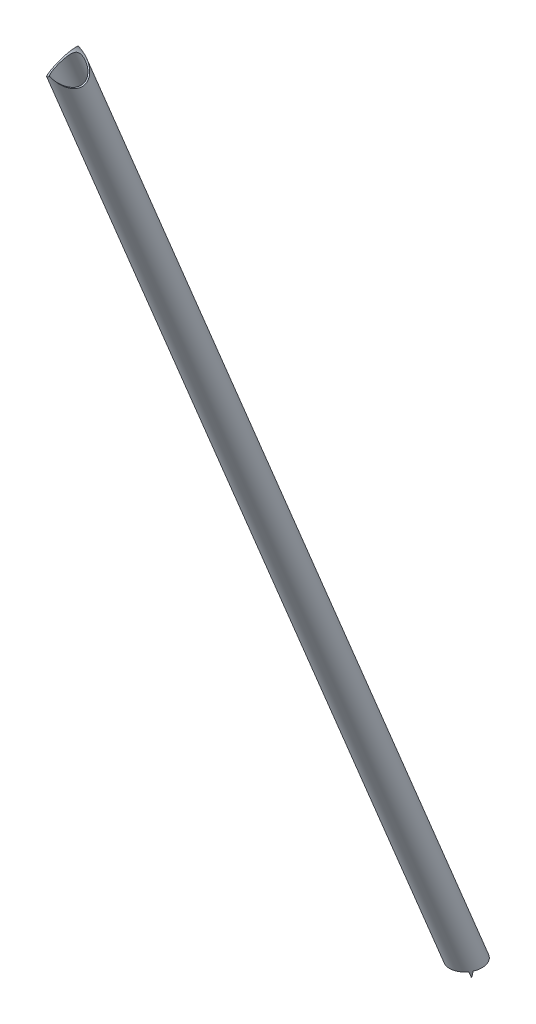
ISO-10303-21;
HEADER;
FILE_DESCRIPTION(('STEP AP214'),'2;1');
FILE_NAME('part.step','',(''),(''),'','','');
FILE_SCHEMA(('AUTOMOTIVE_DESIGN { 1 0 10303 214 1 1 1 1 }'));
ENDSEC;
DATA;
#1=APPLICATION_CONTEXT('core data for automotive mechanical design processes');
#2=APPLICATION_PROTOCOL_DEFINITION('international standard','automotive_design',2000,#1);
#3=PRODUCT_CONTEXT('',#1,'mechanical');
#4=PRODUCT('Part','Part','',(#3));
#5=PRODUCT_RELATED_PRODUCT_CATEGORY('part','',(#4));
#6=PRODUCT_DEFINITION_FORMATION('','',#4);
#7=PRODUCT_DEFINITION_CONTEXT('part definition',#1,'design');
#8=PRODUCT_DEFINITION('design','',#6,#7);
#9=PRODUCT_DEFINITION_SHAPE('','',#8);
#10=(LENGTH_UNIT() NAMED_UNIT(*) SI_UNIT(.MILLI.,.METRE.));
#11=(NAMED_UNIT(*) PLANE_ANGLE_UNIT() SI_UNIT($,.RADIAN.));
#12=(NAMED_UNIT(*) SI_UNIT($,.STERADIAN.) SOLID_ANGLE_UNIT());
#13=UNCERTAINTY_MEASURE_WITH_UNIT(LENGTH_MEASURE(1.E-05),#10,'distance_accuracy_value','');
#14=(GEOMETRIC_REPRESENTATION_CONTEXT(3) GLOBAL_UNCERTAINTY_ASSIGNED_CONTEXT((#13)) GLOBAL_UNIT_ASSIGNED_CONTEXT((#10,
#11,#12)) REPRESENTATION_CONTEXT('',''));
#15=CARTESIAN_POINT('',(0.,0.,0.));
#16=DIRECTION('',(0.,0.,1.));
#17=DIRECTION('',(1.,0.,0.));
#18=AXIS2_PLACEMENT_3D('',#15,#16,#17);
#19=CARTESIAN_POINT('',(-1.11022302462516E-13,220.,-2300.));
#20=DIRECTION('',(0.,0.924802742541058,0.380446957391614));
#21=DIRECTION('',(0.,-0.380446957391614,0.924802742541059));
#22=AXIS2_PLACEMENT_3D('',#19,#20,#21);
#23=CYLINDRICAL_SURFACE('',#22,11.3);
#24=CARTESIAN_POINT('',(-11.2687458040523,1004.8226800173,-1978.04643616126));
#25=CARTESIAN_POINT('',(-11.2865523696665,1004.70854791084,-1977.8350239228));
#26=CARTESIAN_POINT('',(-11.2968083806208,1004.60066949885,-1977.61956967504));
#27=CARTESIAN_POINT('',(-11.30191885456,1004.39861350157,-1977.18213308968));
#28=CARTESIAN_POINT('',(-11.2967720729068,1004.30443702414,-1976.96015022596));
#29=CARTESIAN_POINT('',(-11.2710830903614,1004.13066682036,-1976.51136398655));
#30=CARTESIAN_POINT('',(-11.2505377131257,1004.05107610691,-1976.28455962568));
#31=CARTESIAN_POINT('',(-11.1943675321715,1003.90705679274,-1975.82803597576));
#32=CARTESIAN_POINT('',(-11.1587428603624,1003.84262805938,-1975.59831671222));
#33=CARTESIAN_POINT('',(-11.0731670424558,1003.72931323976,-1975.13861797924));
#34=CARTESIAN_POINT('',(-11.0232666374574,1003.68037337571,-1974.90864225538));
#35=CARTESIAN_POINT('',(-10.9099069609047,1003.59756025133,-1974.4493476787));
#36=CARTESIAN_POINT('',(-10.8464478441185,1003.56368681903,-1974.22002881842));
#37=CARTESIAN_POINT('',(-10.7069069146002,1003.51052942502,-1973.76349587879));
#38=CARTESIAN_POINT('',(-10.6308212207814,1003.49124995928,-1973.53628246934));
#39=CARTESIAN_POINT('',(-10.4670582556134,1003.4665934746,-1973.08528800388));
#40=CARTESIAN_POINT('',(-10.3793783479058,1003.46121962332,-1972.86150774147));
#41=CARTESIAN_POINT('',(-10.1633026289968,1003.46390701718,-1972.34659987682));
#42=CARTESIAN_POINT('',(-10.0309227290432,1003.47688911417,-1972.05716054207));
#43=CARTESIAN_POINT('',(-9.74988806537977,1003.52354041488,-1971.4880229878));
#44=CARTESIAN_POINT('',(-9.60122845530434,1003.5572157927,-1971.20832770185));
#45=CARTESIAN_POINT('',(-9.28930272517062,1003.6430347293,-1970.65940421992));
#46=CARTESIAN_POINT('',(-9.12600664755471,1003.69521684341,-1970.39019918789));
#47=CARTESIAN_POINT('',(-8.78673740970921,1003.81574738832,-1969.86374076717));
#48=CARTESIAN_POINT('',(-8.61076418206435,1003.88409590508,-1969.60648744206));
#49=CARTESIAN_POINT('',(-8.17806086381178,1004.06354214064,-1969.00862763146));
#50=CARTESIAN_POINT('',(-7.91613831956516,1004.18100024831,-1968.67367316694));
#51=CARTESIAN_POINT('',(-7.37274403009796,1004.43715999221,-1968.02852520268));
#52=CARTESIAN_POINT('',(-7.09126169880413,1004.57587318175,-1967.71834530963));
#53=CARTESIAN_POINT('',(-6.50995563095446,1004.8689774046,-1967.12409906159));
#54=CARTESIAN_POINT('',(-6.21014204005313,1005.02335979628,-1966.84001847567));
#55=CARTESIAN_POINT('',(-5.59167457349068,1005.34191191047,-1966.29946837379));
#56=CARTESIAN_POINT('',(-5.27303204228159,1005.50607574014,-1966.04298248955));
#57=CARTESIAN_POINT('',(-4.78040600904947,1005.75334190211,-1965.68210665244));
#58=CARTESIAN_POINT('',(-4.61439270140469,1005.8356286149,-1965.5661745195));
#59=CARTESIAN_POINT('',(-4.27662440746054,1005.99948813861,-1965.34247553885));
#60=CARTESIAN_POINT('',(-4.10487043087901,1006.08106107192,-1965.23470726598));
#61=CARTESIAN_POINT('',(-3.75502077722081,1006.24194976214,-1965.0281964025));
#62=CARTESIAN_POINT('',(-3.57692621719724,1006.32126591224,-1964.92945223288));
#63=CARTESIAN_POINT('',(-3.21363038578171,1006.47564188125,-1964.74219247343));
#64=CARTESIAN_POINT('',(-3.02843043413689,1006.55070248422,-1964.65367499623));
#65=CARTESIAN_POINT('',(-2.69484151327059,1006.67698972803,-1964.50808528343));
#66=CARTESIAN_POINT('',(-2.54808961530746,1006.72965841545,-1964.44852399587));
#67=CARTESIAN_POINT('',(-2.24967545158098,1006.82947261195,-1964.33736256774));
#68=CARTESIAN_POINT('',(-2.09801189527622,1006.87661665415,-1964.28576454041));
#69=CARTESIAN_POINT('',(-1.79013712553334,1006.96348209244,-1964.19189478801));
#70=CARTESIAN_POINT('',(-1.63393786764089,1007.00322125967,-1964.14960068895));
#71=CARTESIAN_POINT('',(-1.31707684209714,1007.0734230159,-1964.07560079144));
#72=CARTESIAN_POINT('',(-1.15641895468921,1007.10389341113,-1964.04388608078));
#73=CARTESIAN_POINT('',(-0.866975607799162,1007.14824847329,-1963.99800134437));
#74=CARTESIAN_POINT('',(-0.738889858063716,1007.16430185513,-1963.9815125468));
#75=CARTESIAN_POINT('',(-0.481276892495036,1007.18886914493,-1963.95634605455));
#76=CARTESIAN_POINT('',(-0.351750395619061,1007.19738665632,-1963.94766462658));
#77=CARTESIAN_POINT('',(-0.0921781960286921,1007.20645686817,-1963.9384207529));
#78=CARTESIAN_POINT('',(0.0378672437700233,1007.20701318914,-1963.9378546166));
#79=CARTESIAN_POINT('',(0.29750832599735,1007.20016203207,-1963.94483608625));
#80=CARTESIAN_POINT('',(0.427103947612461,1007.19275419032,-1963.95238406275));
#81=CARTESIAN_POINT('',(0.81262053412939,1007.15914982008,-1963.98676265728));
#82=CARTESIAN_POINT('',(1.06662034339358,1007.12161397549,-1964.02528420499));
#83=CARTESIAN_POINT('',(1.56416372222666,1007.02246629697,-1964.12908319464));
#84=CARTESIAN_POINT('',(1.80768864187702,1006.96081334571,-1964.19440634006));
#85=CARTESIAN_POINT('',(2.27263580727385,1006.82394170595,-1964.34323517227));
#86=CARTESIAN_POINT('',(2.49455755761445,1006.7494110271,-1964.42584997838));
#87=CARTESIAN_POINT('',(2.9282008204083,1006.59051034536,-1964.60710842573));
#88=CARTESIAN_POINT('',(3.1399125545589,1006.50613116486,-1964.70576705208));
#89=CARTESIAN_POINT('',(3.5548709285938,1006.33130192597,-1964.9168347752));
#90=CARTESIAN_POINT('',(3.75808057556241,1006.24082906961,-1965.02929696994));
#91=CARTESIAN_POINT('',(4.15632569615254,1006.05706930216,-1965.26588985657));
#92=CARTESIAN_POINT('',(4.35135825574634,1005.96378140792,-1965.39002465793));
#93=CARTESIAN_POINT('',(4.7185660424083,1005.78422710065,-1965.63822331748));
#94=CARTESIAN_POINT('',(4.89131259735197,1005.6980044791,-1965.76147731101));
#95=CARTESIAN_POINT('',(5.23113071923069,1005.52640745457,-1966.01614659813));
#96=CARTESIAN_POINT('',(5.39820154578771,1005.44103316326,-1966.14756295019));
#97=CARTESIAN_POINT('',(5.89166585071763,1005.18777719386,-1966.55349560887));
#98=CARTESIAN_POINT('',(6.21015021972402,1005.02284365412,-1966.83958528021));
#99=CARTESIAN_POINT('',(6.82663930146702,1004.70836240325,-1967.43975930099));
#100=CARTESIAN_POINT('',(7.12467572618626,1004.55879068035,-1967.7537984832));
#101=CARTESIAN_POINT('',(7.69996943057853,1004.28096436929,-1968.40870498429));
#102=CARTESIAN_POINT('',(7.97724024553179,1004.15269582787,-1968.74955452546));
#103=CARTESIAN_POINT('',(8.60933496011598,1003.88028109283,-1969.59062609757));
#104=CARTESIAN_POINT('',(8.95420573519147,1003.74824584041,-1970.10264810941));
#105=CARTESIAN_POINT('',(9.43113329311802,1003.60176216486,-1970.90327690399));
#106=CARTESIAN_POINT('',(9.5833236956638,1003.5615352492,-1971.17546414817));
#107=CARTESIAN_POINT('',(9.87262532888333,1003.50039696619,-1971.7299201621));
#108=CARTESIAN_POINT('',(10.0097398857039,1003.47948133068,-1972.0121866898));
#109=CARTESIAN_POINT('',(10.2410272519837,1003.46119458027,-1972.52776773712));
#110=CARTESIAN_POINT('',(10.338299844811,1003.45994612885,-1972.75956064461));
#111=CARTESIAN_POINT('',(10.5206985892321,1003.47223431187,-1973.22747646355));
#112=CARTESIAN_POINT('',(10.6058276336703,1003.48576741837,-1973.46359832856));
#113=CARTESIAN_POINT('',(10.7627426397325,1003.52849821095,-1973.93876506451));
#114=CARTESIAN_POINT('',(10.8345338079329,1003.55768976723,-1974.17780875588));
#115=CARTESIAN_POINT('',(10.963677697105,1003.63238519008,-1974.65727591234));
#116=CARTESIAN_POINT('',(11.0210303185817,1003.67788916904,-1974.89769938692));
#117=CARTESIAN_POINT('',(11.1206144197634,1003.78588151325,-1975.37958324538));
#118=CARTESIAN_POINT('',(11.1627459964152,1003.84847751989,-1975.62104031697));
#119=CARTESIAN_POINT('',(11.230585026334,1003.99044225832,-1976.10133210709));
#120=CARTESIAN_POINT('',(11.2562924698085,1004.06981100011,-1976.34016682406));
#121=CARTESIAN_POINT('',(11.290821201793,1004.24477269799,-1976.81300712772));
#122=CARTESIAN_POINT('',(11.2996462749196,1004.34036201259,-1977.04701378512));
#123=CARTESIAN_POINT('',(11.3003327962459,1004.5468220396,-1977.50819560857));
#124=CARTESIAN_POINT('',(11.2921951875212,1004.65769190213,-1977.7353711537));
#125=CARTESIAN_POINT('',(11.2608927638173,1004.88162046957,-1978.15880814728));
#126=CARTESIAN_POINT('',(11.2393093891194,1004.99335547496,-1978.35589156045));
#127=CARTESIAN_POINT('',(11.1830562175245,1005.22706131547,-1978.74204526403));
#128=CARTESIAN_POINT('',(11.1483815478418,1005.34903594878,-1978.93111254152));
#129=CARTESIAN_POINT('',(11.0665370862343,1005.60197983797,-1979.30031847818));
#130=CARTESIAN_POINT('',(11.0193661757033,1005.7329498983,-1979.48045633631));
#131=CARTESIAN_POINT('',(10.9132338221497,1006.0026523891,-1979.83121282723));
#132=CARTESIAN_POINT('',(10.8542700501553,1006.14138634896,-1980.00182957118));
#133=CARTESIAN_POINT('',(10.7041105975112,1006.47209781538,-1980.38762181105));
#134=CARTESIAN_POINT('',(10.6086906958639,1006.6665886358,-1980.59901235814));
#135=CARTESIAN_POINT('',(10.4002001081689,1007.06448286978,-1981.00393887183));
#136=CARTESIAN_POINT('',(10.2871246424097,1007.26788868604,-1981.19746998088));
#137=CARTESIAN_POINT('',(10.0449631925787,1007.68140442016,-1981.56692505889));
#138=CARTESIAN_POINT('',(9.91586262727694,1007.89152031251,-1981.74283272542));
#139=CARTESIAN_POINT('',(9.64331343277268,1008.31617795737,-1982.07724209318));
#140=CARTESIAN_POINT('',(9.49986432848701,1008.53071985623,-1982.23574321771));
#141=CARTESIAN_POINT('',(9.14904346134644,1009.03572452968,-1982.58692468647));
#142=CARTESIAN_POINT('',(8.9365011703482,1009.32724005043,-1982.77294606355));
#143=CARTESIAN_POINT('',(8.49067210928995,1009.91119709578,-1983.11658566201));
#144=CARTESIAN_POINT('',(8.25737719624001,1010.20363894007,-1983.27419265997));
#145=CARTESIAN_POINT('',(7.77091403234092,1010.78717661123,-1983.56337623044));
#146=CARTESIAN_POINT('',(7.51766611699027,1011.07826155986,-1983.69484021868));
#147=CARTESIAN_POINT('',(6.99331949973562,1011.65432663293,-1983.93271840246));
#148=CARTESIAN_POINT('',(6.72222570140573,1011.93930840606,-1984.03913944266));
#149=CARTESIAN_POINT('',(6.15436618397721,1012.50740983876,-1984.23153821989));
#150=CARTESIAN_POINT('',(5.85708870097726,1012.79024440155,-1984.31684607715));
#151=CARTESIAN_POINT('',(5.24259588757131,1013.34052520392,-1984.46513198597));
#152=CARTESIAN_POINT('',(4.92536101643588,1013.60795585466,-1984.52808773853));
#153=CARTESIAN_POINT('',(4.43423470697284,1013.99039267194,-1984.60726085027));
#154=CARTESIAN_POINT('',(4.26851335066463,1014.11440032007,-1984.63105844201));
#155=CARTESIAN_POINT('',(3.93120690594478,1014.35513914093,-1984.67403450747));
#156=CARTESIAN_POINT('',(3.7596208790675,1014.47186914056,-1984.69321223794));
#157=CARTESIAN_POINT('',(3.4105244896226,1014.69601284813,-1984.72728188618));
#158=CARTESIAN_POINT('',(3.23302685366621,1014.80344497792,-1984.74218242075));
#159=CARTESIAN_POINT('',(2.87139370353091,1015.00691558926,-1984.76817550867));
#160=CARTESIAN_POINT('',(2.68726158600218,1015.10295979598,-1984.77926998085));
#161=CARTESIAN_POINT('',(2.35471249113583,1015.26054837164,-1984.79600475988));
#162=CARTESIAN_POINT('',(2.20769672099511,1015.32497125182,-1984.8023116507));
#163=CARTESIAN_POINT('',(1.90954448651622,1015.4436984679,-1984.81320193347));
#164=CARTESIAN_POINT('',(1.75840831119432,1015.49800351141,-1984.81778544598));
#165=CARTESIAN_POINT('',(1.45276799092307,1015.59461856006,-1984.82547218454));
#166=CARTESIAN_POINT('',(1.29827517678699,1015.63696369718,-1984.82857976484));
#167=CARTESIAN_POINT('',(0.986203524332377,1015.70817143694,-1984.83357023829));
#168=CARTESIAN_POINT('',(0.828625618840242,1015.73703805138,-1984.83545349591));
#169=CARTESIAN_POINT('',(0.509567455886818,1015.78017657563,-1984.83819857805));
#170=CARTESIAN_POINT('',(0.348063113252937,1015.79427388225,-1984.83904820142));
#171=CARTESIAN_POINT('',(0.0244514848514762,1015.80649811486,-1984.83978756364));
#172=CARTESIAN_POINT('',(-0.137655759223215,1015.80462612539,-1984.83967736768));
#173=CARTESIAN_POINT('',(-0.461111776574599,1015.78500645972,-1984.8384824985));
#174=CARTESIAN_POINT('',(-0.622459215544781,1015.76723715699,-1984.8373964978));
#175=CARTESIAN_POINT('',(-0.94277768117777,1015.71675101826,-1984.83412135303));
#176=CARTESIAN_POINT('',(-1.10174824408708,1015.68403130357,-1984.8319319965));
#177=CARTESIAN_POINT('',(-1.44885314138634,1015.59700979775,-1984.82565068223));
#178=CARTESIAN_POINT('',(-1.63620952501453,1015.53964183982,-1984.82125861297));
#179=CARTESIAN_POINT('',(-2.00508604366793,1015.40847121015,-1984.8101098202));
#180=CARTESIAN_POINT('',(-2.18660085746615,1015.33465401372,-1984.80335100381));
#181=CARTESIAN_POINT('',(-2.54393392176767,1015.17341357671,-1984.7869834881));
#182=CARTESIAN_POINT('',(-2.71973382611464,1015.08595091532,-1984.77736645636));
#183=CARTESIAN_POINT('',(-3.06518427150108,1014.90020309071,-1984.75486790146));
#184=CARTESIAN_POINT('',(-3.23483626481315,1014.80192050583,-1984.74198715509));
#185=CARTESIAN_POINT('',(-3.71324780138228,1014.50754713314,-1984.69979608487));
#186=CARTESIAN_POINT('',(-4.01494378186293,1014.30060214523,-1984.6659291327));
#187=CARTESIAN_POINT('',(-4.60101534085447,1013.86609101999,-1984.58334667229));
#188=CARTESIAN_POINT('',(-4.88537628531656,1013.63850785247,-1984.53461882135));
#189=CARTESIAN_POINT('',(-5.4388706606823,1013.16863977753,-1984.42056848917));
#190=CARTESIAN_POINT('',(-5.70798118793582,1012.92633383356,-1984.35522181669));
#191=CARTESIAN_POINT('',(-6.23142425831748,1012.43171037349,-1984.20652325071));
#192=CARTESIAN_POINT('',(-6.48576125572377,1012.179395914,-1984.12317682034));
#193=CARTESIAN_POINT('',(-7.00250332492577,1011.64463240975,-1983.92862021715));
#194=CARTESIAN_POINT('',(-7.26354142561223,1011.36152847162,-1983.81556629872));
#195=CARTESIAN_POINT('',(-7.7680257622497,1010.79055616078,-1983.56458283188));
#196=CARTESIAN_POINT('',(-8.01146800670233,1010.50268672513,-1983.426647664));
#197=CARTESIAN_POINT('',(-8.47901865206187,1009.9259618892,-1983.12438306545));
#198=CARTESIAN_POINT('',(-8.70316063378925,1009.63710914926,-1982.96010096321));
#199=CARTESIAN_POINT('',(-9.13041848198685,1009.06153197191,-1982.60340757302));
#200=CARTESIAN_POINT('',(-9.33354328358848,1008.77480667857,-1982.41100832328));
#201=CARTESIAN_POINT('',(-9.79870239071986,1008.08465516249,-1981.9068599994));
#202=CARTESIAN_POINT('',(-10.0485245529814,1007.6840467298,-1981.57935933029));
#203=CARTESIAN_POINT('',(-10.3788543517551,1007.10302058263,-1981.04068099547));
#204=CARTESIAN_POINT('',(-10.4815294008278,1006.91273647656,-1980.85330693304));
#205=CARTESIAN_POINT('',(-10.6707378944504,1006.54063647608,-1980.46259506305));
#206=CARTESIAN_POINT('',(-10.7572756710615,1006.35881831886,-1980.2592615607));
#207=CARTESIAN_POINT('',(-10.8908202059038,1006.05554108594,-1979.89637914719));
#208=CARTESIAN_POINT('',(-10.9421042140208,1005.93146779384,-1979.74056556195));
#209=CARTESIAN_POINT('',(-11.0349603683753,1005.68980103698,-1979.42122370104));
#210=CARTESIAN_POINT('',(-11.0765342287762,1005.57220643132,-1979.25769679316));
#211=CARTESIAN_POINT('',(-11.1494670282848,1005.34437477942,-1978.92333585237));
#212=CARTESIAN_POINT('',(-11.1808238677687,1005.23413924919,-1978.75250032568));
#213=CARTESIAN_POINT('',(-11.2328657553456,1005.02198001754,-1978.4042347337));
#214=CARTESIAN_POINT('',(-11.2535537940983,1004.92005399357,-1978.22680653143));
#215=CARTESIAN_POINT('',(-11.2687458040523,1004.8226800173,-1978.04643616126));
#216=B_SPLINE_CURVE_WITH_KNOTS('',3,(#24,#25,#26,#27,#28,#29,#30,#31,#32,#33,#34,#35,#36,#37,
#38,#39,#40,#41,#42,#43,#44,#45,#46,#47,#48,#49,#50,#51,#52,#53,#54,#55,#56,#57,#58,#59,#60,#61,
#62,#63,#64,#65,#66,#67,#68,#69,#70,#71,#72,#73,#74,#75,#76,#77,#78,#79,#80,#81,#82,#83,#84,#85,
#86,#87,#88,#89,#90,#91,#92,#93,#94,#95,#96,#97,#98,#99,#100,#101,#102,#103,#104,#105,#106,#107,
#108,#109,#110,#111,#112,#113,#114,#115,#116,#117,#118,#119,#120,#121,#122,#123,#124,#125,#126,
#127,#128,#129,#130,#131,#132,#133,#134,#135,#136,#137,#138,#139,#140,#141,#142,#143,#144,#145,
#146,#147,#148,#149,#150,#151,#152,#153,#154,#155,#156,#157,#158,#159,#160,#161,#162,#163,#164,
#165,#166,#167,#168,#169,#170,#171,#172,#173,#174,#175,#176,#177,#178,#179,#180,#181,#182,#183,
#184,#185,#186,#187,#188,#189,#190,#191,#192,#193,#194,#195,#196,#197,#198,#199,#200,#201,#202,
#203,#204,#205,#206,#207,#208,#209,#210,#211,#212,#213,#214,#215),.UNSPECIFIED.,.T.,.F.,(4,2,2,
2,2,2,2,2,2,2,2,2,2,2,2,2,2,2,2,2,2,2,2,2,2,2,2,2,2,2,2,2,2,2,2,2,2,2,2,2,2,2,2,2,2,2,2,2,2,2,2,
2,2,2,2,2,2,2,2,2,2,2,2,2,2,2,2,2,2,2,2,2,2,2,2,2,2,2,2,2,2,2,2,2,2,2,2,2,2,2,2,2,2,2,2,4),(0.,
0.722535111713449,1.44512861017855,2.16787120257653,2.89060747275875,3.61080613169457,
4.33099657024961,5.05140878832628,5.77198510043044,6.72618807509525,7.68067588607061,
8.63716398994925,9.5936571806709,10.9151374057899,12.2373384931906,13.558814303022,
14.8795018838643,15.5350267281476,16.1904368736778,16.8457321181328,17.5009062325288,
18.0013354804314,18.5018973006218,19.0012418860519,19.5001647479697,19.8901554544875,
20.2799595781476,20.669586425496,21.0592310671132,21.8345239106984,22.611144355245,
23.3547540874473,24.0990623918017,24.8463292474618,25.5938601778576,26.2807977479033,
26.9678245850263,28.3425101660033,29.7150132105833,31.0866137108512,32.9730302691442,
33.9154440017754,34.8576493929872,35.6110995926184,36.3643700040016,37.1173457478895,
37.8703266803329,38.6281636597902,39.3860010910875,40.1436686137594,40.9012940134487,
41.5832777239426,42.2655155301515,42.9478144278123,43.630248205951,44.5369711940676,
45.4439400770559,46.3517403445294,47.259570679417,48.4755344052852,49.691977378014,
50.9135505894252,52.1347895348413,53.3908708766754,54.6482018170959,55.2730341393473,
55.8979669198501,56.5216317361196,57.1449816697822,57.626566017439,58.10811667195,
58.5882377095992,59.0682157510046,59.5538061910245,60.0393636528872,60.5255826678365,
61.0118953427934,61.5989161497243,62.1864573651181,62.7757284981556,63.3648595126905,
64.4653146692227,65.5666863079654,66.6696704302657,67.7723202536089,68.975166874245,
70.1782855015083,71.3792666230996,72.5797350498125,74.296254044744,75.1537829822171,
76.0110813830434,76.6276812142145,77.244172112631,77.8607896217108,78.4772341875553),.UNSPECIFIED.);
#217=CARTESIAN_POINT('',(-11.2687458040523,1004.8226800173,-1978.04643616126));
#218=VERTEX_POINT('',#217);
#219=EDGE_CURVE('E117',#218,#218,#216,.T.);
#220=ORIENTED_EDGE('',*,*,#219,.T.);
#221=EDGE_LOOP('',(#220));
#222=FACE_BOUND('',#221,.T.);
#223=CARTESIAN_POINT('',(-1.11022302462516E-13,230.,-2295.88618264316));
#224=DIRECTION('',(0.,-1.,0.));
#225=DIRECTION('',(0.,0.,1.));
#226=AXIS2_PLACEMENT_3D('',#223,#224,#225);
#227=ELLIPSE('',#226,12.2188218959551,11.3);
#228=CARTESIAN_POINT('',(-1.18516788962073E-13,230.,-2283.66736074721));
#229=VERTEX_POINT('',#228);
#230=EDGE_CURVE('E96',#229,#229,#227,.T.);
#231=ORIENTED_EDGE('',*,*,#230,.T.);
#232=EDGE_LOOP('',(#231));
#233=FACE_BOUND('',#232,.T.);
#234=ADVANCED_FACE('F41',(#222,#233),#23,.F.);
#235=CARTESIAN_POINT('',(0.,904.255410655569,-1942.29450703663));
#236=DIRECTION('',(0.,0.258819045102518,0.965925826289069));
#237=DIRECTION('',(0.,-0.965925826289069,0.258819045102518));
#238=AXIS2_PLACEMENT_3D('',#235,#236,#237);
#239=TOROIDAL_SURFACE('',#238,116.149429379517,12.5);
#240=ORIENTED_EDGE('',*,*,#219,.F.);
#241=EDGE_LOOP('',(#240));
#242=FACE_BOUND('',#241,.T.);
#243=CARTESIAN_POINT('',(-1.19733070153649E-13,1021.20273116938,-1983.9162257196));
#244=CARTESIAN_POINT('',(-0.0055251521565471,1021.19778059355,-1983.91826229488));
#245=CARTESIAN_POINT('',(-0.0110501967386571,1021.19282846484,-1983.92029554908));
#246=CARTESIAN_POINT('',(-0.499943875941092,1020.75448432667,-1984.09992143273));
#247=CARTESIAN_POINT('',(-0.982465187564727,1020.30922719418,-1984.25209165465));
#248=CARTESIAN_POINT('',(-1.94199673250873,1019.39802143756,-1984.50476064857));
#249=CARTESIAN_POINT('',(-2.41900217929063,1018.93205632647,-1984.60521741751));
#250=CARTESIAN_POINT('',(-3.36482022527119,1017.98120245048,-1984.75322387353));
#251=CARTESIAN_POINT('',(-3.83360879785449,1017.49626840862,-1984.80063782783));
#252=CARTESIAN_POINT('',(-4.75760377596963,1016.51170985348,-1984.84004349656));
#253=CARTESIAN_POINT('',(-5.21281649345568,1016.01209238861,-1984.83206138339));
#254=CARTESIAN_POINT('',(-5.99660273781164,1015.12446663032,-1984.76689565946));
#255=CARTESIAN_POINT('',(-6.32902015637514,1014.7389079471,-1984.72216709991));
#256=CARTESIAN_POINT('',(-6.98141058392937,1013.96280711468,-1984.59773741996));
#257=CARTESIAN_POINT('',(-7.30138328189747,1013.57226484126,-1984.51803542611));
#258=CARTESIAN_POINT('',(-7.92556907840923,1012.78906875802,-1984.32187012324));
#259=CARTESIAN_POINT('',(-8.2298119541361,1012.39642061668,-1984.20547947316));
#260=CARTESIAN_POINT('',(-8.81996213791382,1011.61091573199,-1983.93355196678));
#261=CARTESIAN_POINT('',(-9.10587585644294,1011.21805911056,-1983.77802889151));
#262=CARTESIAN_POINT('',(-9.57558916333249,1010.54926440699,-1983.47645112686));
#263=CARTESIAN_POINT('',(-9.76492527307061,1010.27251354567,-1983.34076962194));
#264=CARTESIAN_POINT('',(-10.130726018868,1009.72216658949,-1983.04731600654));
#265=CARTESIAN_POINT('',(-10.3071912705809,1009.44857034426,-1982.88954495372));
#266=CARTESIAN_POINT('',(-10.6451241913147,1008.9067318599,-1982.55105526066));
#267=CARTESIAN_POINT('',(-10.8066052146648,1008.63848502396,-1982.37035740015));
#268=CARTESIAN_POINT('',(-11.1124440527949,1008.10955537036,-1981.98503091563));
#269=CARTESIAN_POINT('',(-11.2568079846195,1007.84886987587,-1981.78041089279));
#270=CARTESIAN_POINT('',(-11.4957051310025,1007.39526955302,-1981.39525277267));
#271=CARTESIAN_POINT('',(-11.5941542725488,1007.20026266148,-1981.21959893106));
#272=CARTESIAN_POINT('',(-11.7778827251209,1006.81825996029,-1980.85348966087));
#273=CARTESIAN_POINT('',(-11.8631694411657,1006.63125968933,-1980.66304264607));
#274=CARTESIAN_POINT('',(-12.0192673478066,1006.26703004074,-1980.26747403003));
#275=CARTESIAN_POINT('',(-12.0900816887005,1006.08979854283,-1980.06235563555));
#276=CARTESIAN_POINT('',(-12.2159281818349,1005.74705379742,-1979.63791851131));
#277=CARTESIAN_POINT('',(-12.2709601583879,1005.58154068039,-1979.4185996235));
#278=CARTESIAN_POINT('',(-12.3644482975159,1005.26285626747,-1978.96462355151));
#279=CARTESIAN_POINT('',(-12.4027463700709,1005.10981334334,-1978.72984321826));
#280=CARTESIAN_POINT('',(-12.4609957124072,1004.81991461386,-1978.24828036576));
#281=CARTESIAN_POINT('',(-12.4809470218152,1004.68305877353,-1978.00149787244));
#282=CARTESIAN_POINT('',(-12.5018369537121,1004.42754812688,-1977.49811867728));
#283=CARTESIAN_POINT('',(-12.502789523958,1004.30888003171,-1977.24152931375));
#284=CARTESIAN_POINT('',(-12.4855220544669,1004.09117201284,-1976.72079658015));
#285=CARTESIAN_POINT('',(-12.4673043957953,1003.99212965334,-1976.45665415218));
#286=CARTESIAN_POINT('',(-12.4159132450404,1003.82712846836,-1975.96093454257));
#287=CARTESIAN_POINT('',(-12.3851974632222,1003.75847736865,-1975.72998953531));
#288=CARTESIAN_POINT('',(-12.3103447905511,1003.63668940408,-1975.26622893373));
#289=CARTESIAN_POINT('',(-12.2662097298013,1003.58355042562,-1975.03341359871));
#290=CARTESIAN_POINT('',(-12.1652135434435,1003.49272868142,-1974.56748814657));
#291=CARTESIAN_POINT('',(-12.1083494057124,1003.45504957999,-1974.3343779727));
#292=CARTESIAN_POINT('',(-11.9827660945226,1003.39482408709,-1973.86938313934));
#293=CARTESIAN_POINT('',(-11.9140445595081,1003.37228071449,-1973.63749873347));
#294=CARTESIAN_POINT('',(-11.7471069824829,1003.33795315691,-1973.11844107344));
#295=CARTESIAN_POINT('',(-11.6458157094618,1003.3302825385,-1972.8319792296));
#296=CARTESIAN_POINT('',(-11.4281465429868,1003.33630099089,-1972.26509433352));
#297=CARTESIAN_POINT('',(-11.3117654458381,1003.34999460433,-1971.98467257841));
#298=CARTESIAN_POINT('',(-11.0656831331798,1003.39709236235,-1971.4310921841));
#299=CARTESIAN_POINT('',(-10.9359668244155,1003.43051904895,-1971.15794222536));
#300=CARTESIAN_POINT('',(-10.6650538730642,1003.51536635826,-1970.62024464054));
#301=CARTESIAN_POINT('',(-10.5238540363037,1003.56679200068,-1970.35569943675));
#302=CARTESIAN_POINT('',(-10.1727474891284,1003.7099164797,-1969.73138819437));
#303=CARTESIAN_POINT('',(-9.95804509558992,1003.80949440584,-1969.37611072502));
#304=CARTESIAN_POINT('',(-9.51277963052747,1004.03642420902,-1968.68489930148));
#305=CARTESIAN_POINT('',(-9.28221035109,1004.16378699967,-1968.34897301396));
#306=CARTESIAN_POINT('',(-8.80772536010317,1004.4428022058,-1967.69629117969));
#307=CARTESIAN_POINT('',(-8.56378640394484,1004.59449786915,-1967.37957117671));
#308=CARTESIAN_POINT('',(-8.06528569641526,1004.91883144334,-1966.76597179097));
#309=CARTESIAN_POINT('',(-7.81072408177567,1005.09146908466,-1966.46909215298));
#310=CARTESIAN_POINT('',(-7.17562499561859,1005.53729387508,-1965.76503959253));
#311=CARTESIAN_POINT('',(-6.79017491253143,1005.82064790182,-1965.3686989463));
#312=CARTESIAN_POINT('',(-6.00491307436986,1006.41952416026,-1964.61647031858));
#313=CARTESIAN_POINT('',(-5.60509410496436,1006.73506270153,-1964.26060304218));
#314=CARTESIAN_POINT('',(-4.79453632314024,1007.39315930811,-1963.58894972222));
#315=CARTESIAN_POINT('',(-4.38380041506092,1007.73571023381,-1963.27315314483));
#316=CARTESIAN_POINT('',(-3.55402999116179,1008.44384865188,-1962.68141535789));
#317=CARTESIAN_POINT('',(-3.13499892157702,1008.80942670982,-1962.40545797646));
#318=CARTESIAN_POINT('',(-2.26843472272604,1009.58035703615,-1961.87998479471));
#319=CARTESIAN_POINT('',(-1.82056103613,1009.9867899007,-1961.63262080823));
#320=CARTESIAN_POINT('',(-0.920649006157564,1010.8183551915,-1961.18321894917));
#321=CARTESIAN_POINT('',(-0.468617665764924,1011.24345956674,-1960.98111568955));
#322=CARTESIAN_POINT('',(-0.010361307604595,1011.6816468971,-1960.80023757337));
#323=CARTESIAN_POINT('',(-0.0051807210682247,1011.68660153556,-1960.798195843));
#324=CARTESIAN_POINT('',(-1.02311534771383E-13,1011.69155723459,-1960.79615715608));
#325=B_SPLINE_CURVE_WITH_KNOTS('',3,(#243,#244,#245,#246,#247,#248,#249,#250,#251,#252,#253,
#254,#255,#256,#257,#258,#259,#260,#261,#262,#263,#264,#265,#266,#267,#268,#269,#270,#271,#272,
#273,#274,#275,#276,#277,#278,#279,#280,#281,#282,#283,#284,#285,#286,#287,#288,#289,#290,#291,
#292,#293,#294,#295,#296,#297,#298,#299,#300,#301,#302,#303,#304,#305,#306,#307,#308,#309,#310,
#311,#312,#313,#314,#315,#316,#317,#318,#319,#320,#321,#322,#323,#324),.UNSPECIFIED.,.F.,.F.,(4,
2,2,2,2,2,2,2,2,2,2,2,2,2,2,2,2,2,2,2,2,2,2,2,2,2,2,2,2,2,2,2,2,2,2,2,2,2,2,2,4),(0.,
0.0230793020472013,2.04225519449719,4.06306853900033,6.08904125670304,8.11405685028036,
9.64593502737254,11.1778514651069,12.7067529271684,14.2351167174613,15.3195074658689,
16.4038463103862,17.4872092911792,18.5701839418715,19.410386614178,20.2501148620104,
21.0896601254826,21.9292147343115,22.7765378509737,23.6238591375256,24.4705583477041,
25.3171524048205,26.0449351960296,26.7726187776943,27.5004747358727,28.2284758237738,
29.1389662006476,30.0496501996737,30.9613765340548,31.8733573405971,33.1520769121994,
34.4312996584599,35.7128217430223,36.9943273373015,38.8553258260453,40.7172721096063,
42.5787279040912,44.4394259429602,46.3979121123639,48.3535503864332,48.3759110683054),.UNSPECIFIED.);
#326=CARTESIAN_POINT('',(-1.19733070153649E-13,1021.20273116938,-1983.9162257196));
#327=VERTEX_POINT('',#326);
#328=CARTESIAN_POINT('',(-1.02311534771383E-13,1011.69155723459,-1960.79615715608));
#329=VERTEX_POINT('',#328);
#330=EDGE_CURVE('E118',#327,#329,#325,.T.);
#331=ORIENTED_EDGE('',*,*,#330,.T.);
#332=CARTESIAN_POINT('',(-1.02311534771383E-13,1011.69155723459,-1960.79615715608));
#333=CARTESIAN_POINT('',(0.0051807187432579,1011.68660153816,-1960.79819584255));
#334=CARTESIAN_POINT('',(0.0103613052754807,1011.68164689969,-1960.80023757291));
#335=CARTESIAN_POINT('',(0.513827471010642,1011.20022965717,-1960.99896038353));
#336=CARTESIAN_POINT('',(1.01087123007003,1010.73357467523,-1961.22378828712));
#337=CARTESIAN_POINT('',(1.99928677238179,1009.82349508708,-1961.72778102554));
#338=CARTESIAN_POINT('',(2.49065332075096,1009.38009076499,-1962.00699233596));
#339=CARTESIAN_POINT('',(3.4654642241755,1008.51991971658,-1962.6193757105));
#340=CARTESIAN_POINT('',(3.94888857284996,1008.1032143038,-1962.95266617816));
#341=CARTESIAN_POINT('',(4.90295983767211,1007.30290470243,-1963.67249200999));
#342=CARTESIAN_POINT('',(5.37361462458821,1006.91927979103,-1964.05899364088));
#343=CARTESIAN_POINT('',(6.14173213058088,1006.31469519112,-1964.74619868815));
#344=CARTESIAN_POINT('',(6.44399707154035,1006.08255964217,-1965.03178610624));
#345=CARTESIAN_POINT('',(7.03949072668853,1005.63819183022,-1965.62700246391));
#346=CARTESIAN_POINT('',(7.33271947705768,1005.42595948752,-1965.93663130721));
#347=CARTESIAN_POINT('',(7.90748238050957,1005.02488744524,-1966.57959916104));
#348=CARTESIAN_POINT('',(8.18903887742755,1004.83600153594,-1966.91288921012));
#349=CARTESIAN_POINT('',(8.73842726605277,1004.48489236276,-1967.60393525341));
#350=CARTESIAN_POINT('',(9.00626364433428,1004.32266034408,-1967.96168315924));
#351=CARTESIAN_POINT('',(9.45153540731505,1004.07084735316,-1968.59697089012));
#352=CARTESIAN_POINT('',(9.63312871124329,1003.97369125751,-1968.86860828575));
#353=CARTESIAN_POINT('',(9.98597818386559,1003.79739117791,-1969.42423114778));
#354=CARTESIAN_POINT('',(10.1572347435846,1003.7182465123,-1969.70821614639));
#355=CARTESIAN_POINT('',(10.4874012599958,1003.580225099,-1970.28774531687));
#356=CARTESIAN_POINT('',(10.6463221623021,1003.52133022046,-1970.58327888315));
#357=CARTESIAN_POINT('',(10.9497771534887,1003.4260981514,-1971.1851437735));
#358=CARTESIAN_POINT('',(11.0943165223684,1003.3897526563,-1971.49147107844));
#359=CARTESIAN_POINT('',(11.3369819809091,1003.34721736465,-1972.04584400228));
#360=CARTESIAN_POINT('',(11.4383698879288,1003.33619204564,-1972.29209541668));
#361=CARTESIAN_POINT('',(11.6295092805935,1003.33056528231,-1972.78914783451));
#362=CARTESIAN_POINT('',(11.7192672799119,1003.33595460267,-1973.03994620078));
#363=CARTESIAN_POINT('',(11.885855609849,1003.36413664192,-1973.54476891374));
#364=CARTESIAN_POINT('',(11.9626906196988,1003.38692304496,-1973.7987920568));
#365=CARTESIAN_POINT('',(12.1021905542243,1003.45066871051,-1974.30848016982));
#366=CARTESIAN_POINT('',(12.1648553680053,1003.49162811524,-1974.56414515261));
#367=CARTESIAN_POINT('',(12.2752516678694,1003.59252621988,-1975.0769613015));
#368=CARTESIAN_POINT('',(12.3228735588819,1003.65259808407,-1975.33411007578));
#369=CARTESIAN_POINT('',(12.4016339472357,1003.79165267648,-1975.84582502688));
#370=CARTESIAN_POINT('',(12.4327724515623,1003.87063539668,-1976.1003912048));
#371=CARTESIAN_POINT('',(12.4779626403258,1004.04701985509,-1976.60454077908));
#372=CARTESIAN_POINT('',(12.4920187892596,1004.14441677304,-1976.8541254606));
#373=CARTESIAN_POINT('',(12.5028617288961,1004.35669241589,-1977.3461162718));
#374=CARTESIAN_POINT('',(12.4996496509285,1004.47156999506,-1977.58852287073));
#375=CARTESIAN_POINT('',(12.4774483730428,1004.70417732346,-1978.03848758461));
#376=CARTESIAN_POINT('',(12.4601966956774,1004.82026560437,-1978.24698600895));
#377=CARTESIAN_POINT('',(12.4125380628748,1005.06409181192,-1978.65545215923));
#378=CARTESIAN_POINT('',(12.3821325507481,1005.19182845923,-1978.85542081846));
#379=CARTESIAN_POINT('',(12.3087495017229,1005.4577213184,-1979.24594758572));
#380=CARTESIAN_POINT('',(12.2657690100552,1005.59587997347,-1979.4365034697));
#381=CARTESIAN_POINT('',(12.1679634683851,1005.8813039028,-1979.80750442318));
#382=CARTESIAN_POINT('',(12.1131360700301,1006.02857097843,-1979.98794747912));
#383=CARTESIAN_POINT('',(11.973097441506,1006.37938156672,-1980.39439828582));
#384=CARTESIAN_POINT('',(11.8837792025619,1006.58584138135,-1980.61648726741));
#385=CARTESIAN_POINT('',(11.6878186555702,1007.00967661927,-1981.0417911926));
#386=CARTESIAN_POINT('',(11.5811717994592,1007.22705489783,-1981.24500115916));
#387=CARTESIAN_POINT('',(11.352294256982,1007.67060077561,-1981.63283283804));
#388=CARTESIAN_POINT('',(11.2300417332756,1007.89678037633,-1981.81742784142));
#389=CARTESIAN_POINT('',(10.9718475540213,1008.35555186167,-1982.16805829968));
#390=CARTESIAN_POINT('',(10.8359051631343,1008.58814409024,-1982.33409275658));
#391=CARTESIAN_POINT('',(10.4982934385701,1009.14673691042,-1982.70747773341));
#392=CARTESIAN_POINT('',(10.2911838925507,1009.47485538793,-1982.90676624099));
#393=CARTESIAN_POINT('',(9.85760736826247,1010.13633268272,-1983.27295051472));
#394=CARTESIAN_POINT('',(9.63113346149979,1010.46969334052,-1983.43983461626));
#395=CARTESIAN_POINT('',(9.16153473695275,1011.13926404482,-1983.74318681681));
#396=CARTESIAN_POINT('',(8.91838620499387,1011.47547752752,-1983.87961037186));
#397=CARTESIAN_POINT('',(8.41827502149819,1012.14804066117,-1984.12342502194));
#398=CARTESIAN_POINT('',(8.16131242099561,1012.48439031161,-1984.2308162242));
#399=CARTESIAN_POINT('',(7.538785617732,1013.2791999074,-1984.45263351972));
#400=CARTESIAN_POINT('',(7.16808263921204,1013.73700346456,-1984.55508034176));
#401=CARTESIAN_POINT('',(6.40906797735749,1014.64630330806,-1984.711853211));
#402=CARTESIAN_POINT('',(6.0207491211721,1015.09779692543,-1984.76615946802));
#403=CARTESIAN_POINT('',(5.23026861418586,1015.99159261056,-1984.82922626816));
#404=CARTESIAN_POINT('',(4.82810863802974,1016.43389577996,-1984.83799230185));
#405=CARTESIAN_POINT('',(4.01316499035165,1017.30691753619,-1984.81201005835));
#406=CARTESIAN_POINT('',(3.600384974652,1017.73764000783,-1984.77727656415));
#407=CARTESIAN_POINT('',(2.66448417844947,1018.68974566375,-1984.65213683966));
#408=CARTESIAN_POINT('',(2.13914166386203,1019.20744126177,-1984.55016113324));
#409=CARTESIAN_POINT('',(1.08171950534723,1020.21750537149,-1984.28313190373));
#410=CARTESIAN_POINT('',(0.549652731354193,1020.70991516239,-1984.11818515235));
#411=CARTESIAN_POINT('',(0.0110501946150776,1021.19282846669,-1983.92029554787));
#412=CARTESIAN_POINT('',(0.00552515004366155,1021.19778059539,-1983.91826229368));
#413=CARTESIAN_POINT('',(-1.19733070153649E-13,1021.20273116938,-1983.9162257196));
#414=B_SPLINE_CURVE_WITH_KNOTS('',3,(#332,#333,#334,#335,#336,#337,#338,#339,#340,#341,#342,
#343,#344,#345,#346,#347,#348,#349,#350,#351,#352,#353,#354,#355,#356,#357,#358,#359,#360,#361,
#362,#363,#364,#365,#366,#367,#368,#369,#370,#371,#372,#373,#374,#375,#376,#377,#378,#379,#380,
#381,#382,#383,#384,#385,#386,#387,#388,#389,#390,#391,#392,#393,#394,#395,#396,#397,#398,#399,
#400,#401,#402,#403,#404,#405,#406,#407,#408,#409,#410,#411,#412,#413),.UNSPECIFIED.,.F.,.F.,(4,
2,2,2,2,2,2,2,2,2,2,2,2,2,2,2,2,2,2,2,2,2,2,2,2,2,2,2,2,2,2,2,2,2,2,2,2,2,2,2,4),(0.,
0.0223606818721025,2.17313974375197,4.32576497247661,6.48316848823894,8.63921056017978,
10.0669984089186,11.4947805401245,12.919689792035,14.3441300746137,15.3660410732372,
16.3879133900978,17.4088683655335,18.4294471162769,19.2283324364281,20.0267683651312,
20.8249145662048,21.6230670132855,22.4269069971647,23.2307466403949,24.0343761538277,
24.8379530180351,25.5549325094954,26.2718333499954,26.9889027776605,27.706114477007,
28.6530604586768,29.6002553781411,30.5487905630088,31.4973767248144,32.8040302134619,
34.1111531898877,35.4201752962244,36.7291925668873,38.5203781769378,40.3122997875408,
42.1040053495058,43.8951021794291,46.125691418711,48.3525152193304,48.3755945213777),.UNSPECIFIED.);
#415=EDGE_CURVE('E65',#329,#327,#414,.T.);
#416=ORIENTED_EDGE('',*,*,#415,.T.);
#417=EDGE_LOOP('',(#331,#416));
#418=FACE_BOUND('',#417,.T.);
#419=ADVANCED_FACE('F43',(#242,#418),#239,.F.);
#420=CARTESIAN_POINT('',(-1.11022302462516E-13,220.,-2300.));
#421=DIRECTION('',(0.,0.924802742541058,0.380446957391614));
#422=DIRECTION('',(0.,-0.380446957391614,0.924802742541059));
#423=AXIS2_PLACEMENT_3D('',#420,#421,#422);
#424=CYLINDRICAL_SURFACE('',#423,12.5);
#425=ORIENTED_EDGE('',*,*,#330,.F.);
#426=ORIENTED_EDGE('',*,*,#415,.F.);
#427=EDGE_LOOP('',(#425,#426));
#428=FACE_BOUND('',#427,.T.);
#429=DIRECTION('',(0.,0.924802742541058,0.380446957391614));
#430=VECTOR('',#429,1.);
#431=CARTESIAN_POINT('',(-10.,217.146647819563,-2293.06397943094));
#432=LINE('',#431,#430);
#433=CARTESIAN_POINT('',(-10.,230.,-2287.7763451016));
#434=VERTEX_POINT('',#433);
#435=CARTESIAN_POINT('',(-10.,224.594667906914,-2290.));
#436=VERTEX_POINT('',#435);
#437=EDGE_CURVE('E11',#434,#436,#432,.F.);
#438=ORIENTED_EDGE('',*,*,#437,.F.);
#439=CARTESIAN_POINT('',(-1.11022302462516E-13,230.,-2295.88618264316));
#440=DIRECTION('',(0.,-1.,0.));
#441=DIRECTION('',(0.,0.,1.));
#442=AXIS2_PLACEMENT_3D('',#439,#440,#441);
#443=ELLIPSE('',#442,13.5163959026052,12.5);
#444=CARTESIAN_POINT('',(10.,230.,-2287.7763451016));
#445=VERTEX_POINT('',#444);
#446=EDGE_CURVE('E50',#445,#434,#443,.T.);
#447=ORIENTED_EDGE('',*,*,#446,.F.);
#448=DIRECTION('',(0.,0.924802742541058,0.380446957391614));
#449=VECTOR('',#448,1.);
#450=CARTESIAN_POINT('',(10.,217.146647819563,-2293.06397943094));
#451=LINE('',#450,#449);
#452=CARTESIAN_POINT('',(10.,224.594667906915,-2290.));
#453=VERTEX_POINT('',#452);
#454=EDGE_CURVE('E150',#453,#445,#451,.T.);
#455=ORIENTED_EDGE('',*,*,#454,.F.);
#456=CARTESIAN_POINT('',(-1.11022302462516E-13,244.30832273917,-2290.));
#457=DIRECTION('',(0.,0.,-1.));
#458=DIRECTION('',(0.,1.,0.));
#459=AXIS2_PLACEMENT_3D('',#456,#457,#458);
#460=ELLIPSE('',#459,32.8560913870921,12.5);
#461=CARTESIAN_POINT('',(11.2524520846539,230.,-2290.));
#462=VERTEX_POINT('',#461);
#463=EDGE_CURVE('E146',#462,#453,#460,.T.);
#464=ORIENTED_EDGE('',*,*,#463,.F.);
#465=CARTESIAN_POINT('',(-11.2524520846541,230.,-2290.));
#466=VERTEX_POINT('',#465);
#467=EDGE_CURVE('E148',#466,#462,#443,.T.);
#468=ORIENTED_EDGE('',*,*,#467,.F.);
#469=CARTESIAN_POINT('',(-1.11022302462516E-13,244.30832273917,-2290.));
#470=DIRECTION('',(0.,0.,-1.));
#471=DIRECTION('',(0.,1.,0.));
#472=AXIS2_PLACEMENT_3D('',#469,#470,#471);
#473=ELLIPSE('',#472,32.8560913870921,12.5);
#474=EDGE_CURVE('E109',#436,#466,#473,.T.);
#475=ORIENTED_EDGE('',*,*,#474,.F.);
#476=EDGE_LOOP('',(#438,#447,#455,#464,#468,#475));
#477=FACE_BOUND('',#476,.T.);
#478=ADVANCED_FACE('F129',(#428,#477),#424,.T.);
#479=CARTESIAN_POINT('',(250.,214.,-2290.));
#480=DIRECTION('',(0.,0.,-1.));
#481=DIRECTION('',(-1.,0.,0.));
#482=AXIS2_PLACEMENT_3D('',#479,#480,#481);
#483=PLANE('',#482);
#484=ORIENTED_EDGE('',*,*,#463,.T.);
#485=DIRECTION('',(0.,-1.,0.));
#486=VECTOR('',#485,1.);
#487=CARTESIAN_POINT('',(10.,214.,-2290.));
#488=LINE('',#487,#486);
#489=CARTESIAN_POINT('',(10.,230.,-2290.));
#490=VERTEX_POINT('',#489);
#491=EDGE_CURVE('E106',#490,#453,#488,.T.);
#492=ORIENTED_EDGE('',*,*,#491,.F.);
#493=DIRECTION('',(-1.,0.,0.));
#494=VECTOR('',#493,1.);
#495=CARTESIAN_POINT('',(250.,230.,-2290.));
#496=LINE('',#495,#494);
#497=EDGE_CURVE('E57',#462,#490,#496,.T.);
#498=ORIENTED_EDGE('',*,*,#497,.F.);
#499=EDGE_LOOP('',(#484,#492,#498));
#500=FACE_BOUND('',#499,.T.);
#501=ADVANCED_FACE('F133',(#500),#483,.T.);
#502=ORIENTED_EDGE('',*,*,#474,.T.);
#503=CARTESIAN_POINT('',(-10.,230.,-2290.));
#504=VERTEX_POINT('',#503);
#505=EDGE_CURVE('E102',#504,#466,#496,.T.);
#506=ORIENTED_EDGE('',*,*,#505,.F.);
#507=DIRECTION('',(0.,1.,0.));
#508=VECTOR('',#507,1.);
#509=CARTESIAN_POINT('',(-10.,226.,-2290.));
#510=LINE('',#509,#508);
#511=EDGE_CURVE('E88',#436,#504,#510,.T.);
#512=ORIENTED_EDGE('',*,*,#511,.F.);
#513=EDGE_LOOP('',(#502,#506,#512));
#514=FACE_BOUND('',#513,.T.);
#515=ADVANCED_FACE('F108',(#514),#483,.T.);
#516=CARTESIAN_POINT('',(-6.00000000000001,230.,-2300.));
#517=DIRECTION('',(0.,-1.,0.));
#518=DIRECTION('',(1.,0.,0.));
#519=AXIS2_PLACEMENT_3D('',#516,#517,#518);
#520=PLANE('',#519);
#521=ORIENTED_EDGE('',*,*,#230,.F.);
#522=EDGE_LOOP('',(#521));
#523=FACE_BOUND('',#522,.T.);
#524=ORIENTED_EDGE('',*,*,#467,.T.);
#525=ORIENTED_EDGE('',*,*,#497,.T.);
#526=DIRECTION('',(0.,0.,1.));
#527=VECTOR('',#526,1.);
#528=CARTESIAN_POINT('',(10.,230.,-2300.));
#529=LINE('',#528,#527);
#530=EDGE_CURVE('E97',#490,#445,#529,.T.);
#531=ORIENTED_EDGE('',*,*,#530,.T.);
#532=ORIENTED_EDGE('',*,*,#446,.T.);
#533=DIRECTION('',(0.,0.,1.));
#534=VECTOR('',#533,1.);
#535=CARTESIAN_POINT('',(-10.,230.,-2300.));
#536=LINE('',#535,#534);
#537=EDGE_CURVE('E91',#504,#434,#536,.T.);
#538=ORIENTED_EDGE('',*,*,#537,.F.);
#539=ORIENTED_EDGE('',*,*,#505,.T.);
#540=EDGE_LOOP('',(#524,#525,#531,#532,#538,#539));
#541=FACE_BOUND('',#540,.T.);
#542=ADVANCED_FACE('F101',(#523,#541),#520,.T.);
#543=CARTESIAN_POINT('',(-10.,226.,-2300.));
#544=DIRECTION('',(1.,0.,0.));
#545=DIRECTION('',(0.,1.,0.));
#546=AXIS2_PLACEMENT_3D('',#543,#544,#545);
#547=PLANE('',#546);
#548=ORIENTED_EDGE('',*,*,#437,.T.);
#549=ORIENTED_EDGE('',*,*,#511,.T.);
#550=ORIENTED_EDGE('',*,*,#537,.T.);
#551=EDGE_LOOP('',(#548,#549,#550));
#552=FACE_BOUND('',#551,.T.);
#553=ADVANCED_FACE('F90',(#552),#547,.T.);
#554=CARTESIAN_POINT('',(10.,214.,-2300.));
#555=DIRECTION('',(-1.,0.,0.));
#556=DIRECTION('',(0.,-1.,0.));
#557=AXIS2_PLACEMENT_3D('',#554,#555,#556);
#558=PLANE('',#557);
#559=ORIENTED_EDGE('',*,*,#454,.T.);
#560=ORIENTED_EDGE('',*,*,#530,.F.);
#561=ORIENTED_EDGE('',*,*,#491,.T.);
#562=EDGE_LOOP('',(#559,#560,#561));
#563=FACE_BOUND('',#562,.T.);
#564=ADVANCED_FACE('F154',(#563),#558,.T.);
#565=CLOSED_SHELL('',(#234,#419,#478,#501,#515,#542,#553,#564));
#566=MANIFOLD_SOLID_BREP('B2',#565);
#567=ADVANCED_BREP_SHAPE_REPRESENTATION('',(#18,#566),#14);
#568=SHAPE_DEFINITION_REPRESENTATION(#9,#567);
ENDSEC;
END-ISO-10303-21;
